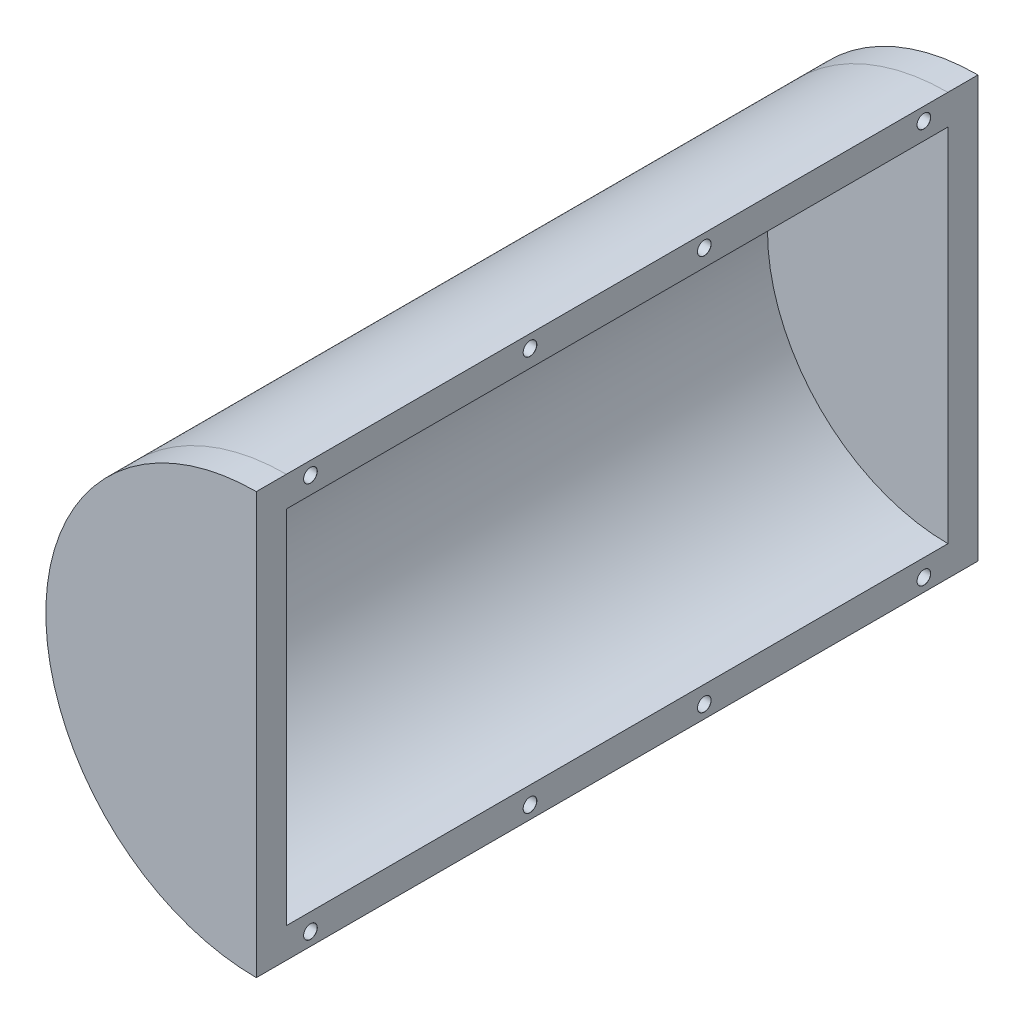
ISO-10303-21;
HEADER;
FILE_DESCRIPTION(('STEP AP214'),'2;1');
FILE_NAME('part.step','',(''),(''),'','','');
FILE_SCHEMA(('AUTOMOTIVE_DESIGN { 1 0 10303 214 1 1 1 1 }'));
ENDSEC;
DATA;
#1=APPLICATION_CONTEXT('core data for automotive mechanical design processes');
#2=APPLICATION_PROTOCOL_DEFINITION('international standard','automotive_design',2000,#1);
#3=PRODUCT_CONTEXT('',#1,'mechanical');
#4=PRODUCT('Part','Part','',(#3));
#5=PRODUCT_RELATED_PRODUCT_CATEGORY('part','',(#4));
#6=PRODUCT_DEFINITION_FORMATION('','',#4);
#7=PRODUCT_DEFINITION_CONTEXT('part definition',#1,'design');
#8=PRODUCT_DEFINITION('design','',#6,#7);
#9=PRODUCT_DEFINITION_SHAPE('','',#8);
#10=(LENGTH_UNIT() NAMED_UNIT(*) SI_UNIT(.MILLI.,.METRE.));
#11=(NAMED_UNIT(*) PLANE_ANGLE_UNIT() SI_UNIT($,.RADIAN.));
#12=(NAMED_UNIT(*) SI_UNIT($,.STERADIAN.) SOLID_ANGLE_UNIT());
#13=UNCERTAINTY_MEASURE_WITH_UNIT(LENGTH_MEASURE(1.E-05),#10,'distance_accuracy_value','');
#14=(GEOMETRIC_REPRESENTATION_CONTEXT(3) GLOBAL_UNCERTAINTY_ASSIGNED_CONTEXT((#13)) GLOBAL_UNIT_ASSIGNED_CONTEXT((#10,
#11,#12)) REPRESENTATION_CONTEXT('',''));
#15=CARTESIAN_POINT('',(0.,0.,0.));
#16=DIRECTION('',(0.,0.,1.));
#17=DIRECTION('',(1.,0.,0.));
#18=AXIS2_PLACEMENT_3D('',#15,#16,#17);
#19=CARTESIAN_POINT('',(0.,70.0043098323688,-110.));
#20=DIRECTION('',(-1.,0.,0.));
#21=DIRECTION('',(0.,0.,1.));
#22=AXIS2_PLACEMENT_3D('',#19,#20,#21);
#23=PLANE('',#22);
#24=DIRECTION('',(0.,0.,1.));
#25=VECTOR('',#24,1.);
#26=CARTESIAN_POINT('',(0.,-60.,-110.));
#27=LINE('',#26,#25);
#28=CARTESIAN_POINT('',(0.,-60.,-110.));
#29=VERTEX_POINT('',#28);
#30=CARTESIAN_POINT('',(0.,-60.,110.));
#31=VERTEX_POINT('',#30);
#32=EDGE_CURVE('E273',#29,#31,#27,.T.);
#33=ORIENTED_EDGE('',*,*,#32,.T.);
#34=DIRECTION('',(0.,1.,0.));
#35=VECTOR('',#34,1.);
#36=CARTESIAN_POINT('',(0.,70.0043098323688,110.));
#37=LINE('',#36,#35);
#38=CARTESIAN_POINT('',(0.,60.,110.));
#39=VERTEX_POINT('',#38);
#40=EDGE_CURVE('E158',#31,#39,#37,.T.);
#41=ORIENTED_EDGE('',*,*,#40,.T.);
#42=DIRECTION('',(0.,0.,1.));
#43=VECTOR('',#42,1.);
#44=CARTESIAN_POINT('',(0.,60.,-110.));
#45=LINE('',#44,#43);
#46=CARTESIAN_POINT('',(0.,60.,-110.));
#47=VERTEX_POINT('',#46);
#48=EDGE_CURVE('E101',#47,#39,#45,.T.);
#49=ORIENTED_EDGE('',*,*,#48,.F.);
#50=DIRECTION('',(0.,1.,0.));
#51=VECTOR('',#50,1.);
#52=CARTESIAN_POINT('',(0.,-60.,-110.));
#53=LINE('',#52,#51);
#54=EDGE_CURVE('E94',#29,#47,#53,.T.);
#55=ORIENTED_EDGE('',*,*,#54,.F.);
#56=EDGE_LOOP('',(#33,#41,#49,#55));
#57=FACE_BOUND('',#56,.T.);
#58=CARTESIAN_POINT('',(0.,-65.7095087836172,102.000000000089));
#59=DIRECTION('',(1.,0.,0.));
#60=DIRECTION('',(0.,0.,-1.));
#61=AXIS2_PLACEMENT_3D('',#58,#59,#60);
#62=CIRCLE('',#61,2.275);
#63=CARTESIAN_POINT('',(0.,-65.7095087836172,99.7250000000891));
#64=VERTEX_POINT('',#63);
#65=EDGE_CURVE('E194',#64,#64,#62,.T.);
#66=ORIENTED_EDGE('',*,*,#65,.F.);
#67=EDGE_LOOP('',(#66));
#68=FACE_BOUND('',#67,.T.);
#69=CARTESIAN_POINT('',(0.,65.7095087836172,102.000000000089));
#70=DIRECTION('',(1.,0.,0.));
#71=DIRECTION('',(0.,0.,-1.));
#72=AXIS2_PLACEMENT_3D('',#69,#70,#71);
#73=CIRCLE('',#72,2.275);
#74=CARTESIAN_POINT('',(0.,65.7095087836172,99.7250000000891));
#75=VERTEX_POINT('',#74);
#76=EDGE_CURVE('E206',#75,#75,#73,.T.);
#77=ORIENTED_EDGE('',*,*,#76,.F.);
#78=EDGE_LOOP('',(#77));
#79=FACE_BOUND('',#78,.T.);
#80=CARTESIAN_POINT('',(0.,65.7095087836171,-28.9841035327451));
#81=DIRECTION('',(1.,0.,0.));
#82=DIRECTION('',(0.,0.,-1.));
#83=AXIS2_PLACEMENT_3D('',#80,#81,#82);
#84=CIRCLE('',#83,2.275);
#85=CARTESIAN_POINT('',(0.,65.7095087836171,-31.2591035327451));
#86=VERTEX_POINT('',#85);
#87=EDGE_CURVE('E220',#86,#86,#84,.T.);
#88=ORIENTED_EDGE('',*,*,#87,.F.);
#89=EDGE_LOOP('',(#88));
#90=FACE_BOUND('',#89,.T.);
#91=CARTESIAN_POINT('',(0.,-65.7095087836171,-28.9841035327451));
#92=DIRECTION('',(1.,0.,0.));
#93=DIRECTION('',(0.,0.,-1.));
#94=AXIS2_PLACEMENT_3D('',#91,#92,#93);
#95=CIRCLE('',#94,2.275);
#96=CARTESIAN_POINT('',(0.,-65.7095087836171,-31.2591035327451));
#97=VERTEX_POINT('',#96);
#98=EDGE_CURVE('E232',#97,#97,#95,.T.);
#99=ORIENTED_EDGE('',*,*,#98,.F.);
#100=EDGE_LOOP('',(#99));
#101=FACE_BOUND('',#100,.T.);
#102=CARTESIAN_POINT('',(0.,-65.7095087836172,-102.000000000089));
#103=DIRECTION('',(1.,0.,0.));
#104=DIRECTION('',(0.,0.,-1.));
#105=AXIS2_PLACEMENT_3D('',#102,#103,#104);
#106=CIRCLE('',#105,2.275);
#107=CARTESIAN_POINT('',(0.,-65.7095087836172,-104.275000000089));
#108=VERTEX_POINT('',#107);
#109=EDGE_CURVE('E244',#108,#108,#106,.T.);
#110=ORIENTED_EDGE('',*,*,#109,.F.);
#111=EDGE_LOOP('',(#110));
#112=FACE_BOUND('',#111,.T.);
#113=CARTESIAN_POINT('',(0.,65.7095087836172,-102.000000000089));
#114=DIRECTION('',(1.,0.,0.));
#115=DIRECTION('',(0.,0.,-1.));
#116=AXIS2_PLACEMENT_3D('',#113,#114,#115);
#117=CIRCLE('',#116,2.275);
#118=CARTESIAN_POINT('',(0.,65.7095087836172,-104.275000000089));
#119=VERTEX_POINT('',#118);
#120=EDGE_CURVE('E256',#119,#119,#117,.T.);
#121=ORIENTED_EDGE('',*,*,#120,.F.);
#122=EDGE_LOOP('',(#121));
#123=FACE_BOUND('',#122,.T.);
#124=DIRECTION('',(0.,1.,0.));
#125=VECTOR('',#124,1.);
#126=CARTESIAN_POINT('',(0.,70.0043098323688,-120.));
#127=LINE('',#126,#125);
#128=CARTESIAN_POINT('',(0.,-70.0043098323688,-120.));
#129=VERTEX_POINT('',#128);
#130=CARTESIAN_POINT('',(0.,70.0043098323688,-120.));
#131=VERTEX_POINT('',#130);
#132=EDGE_CURVE('E79',#129,#131,#127,.T.);
#133=ORIENTED_EDGE('',*,*,#132,.T.);
#134=DIRECTION('',(0.,0.,-1.));
#135=VECTOR('',#134,1.);
#136=CARTESIAN_POINT('',(0.,70.0043098323688,-110.));
#137=LINE('',#136,#135);
#138=CARTESIAN_POINT('',(0.,70.0021549161844,-110.));
#139=VERTEX_POINT('',#138);
#140=EDGE_CURVE('E54',#139,#131,#137,.T.);
#141=ORIENTED_EDGE('',*,*,#140,.F.);
#142=DIRECTION('',(0.,0.,1.));
#143=VECTOR('',#142,1.);
#144=CARTESIAN_POINT('',(0.,70.,-110.));
#145=LINE('',#144,#143);
#146=CARTESIAN_POINT('',(0.,70.0021549161844,110.));
#147=VERTEX_POINT('',#146);
#148=EDGE_CURVE('E98',#139,#147,#145,.T.);
#149=ORIENTED_EDGE('',*,*,#148,.T.);
#150=DIRECTION('',(0.,0.,1.));
#151=VECTOR('',#150,1.);
#152=CARTESIAN_POINT('',(0.,70.0043098323688,110.));
#153=LINE('',#152,#151);
#154=CARTESIAN_POINT('',(0.,70.0043098323688,120.));
#155=VERTEX_POINT('',#154);
#156=EDGE_CURVE('E143',#147,#155,#153,.T.);
#157=ORIENTED_EDGE('',*,*,#156,.T.);
#158=DIRECTION('',(0.,1.,0.));
#159=VECTOR('',#158,1.);
#160=CARTESIAN_POINT('',(0.,-60.,120.));
#161=LINE('',#160,#159);
#162=CARTESIAN_POINT('',(0.,-70.0043098323688,120.));
#163=VERTEX_POINT('',#162);
#164=EDGE_CURVE('E172',#163,#155,#161,.T.);
#165=ORIENTED_EDGE('',*,*,#164,.F.);
#166=DIRECTION('',(0.,0.,1.));
#167=VECTOR('',#166,1.);
#168=CARTESIAN_POINT('',(0.,-70.0043098323688,110.));
#169=LINE('',#168,#167);
#170=CARTESIAN_POINT('',(0.,-70.0021549161844,110.));
#171=VERTEX_POINT('',#170);
#172=EDGE_CURVE('E151',#171,#163,#169,.T.);
#173=ORIENTED_EDGE('',*,*,#172,.F.);
#174=DIRECTION('',(0.,0.,1.));
#175=VECTOR('',#174,1.);
#176=CARTESIAN_POINT('',(0.,-70.,-110.));
#177=LINE('',#176,#175);
#178=CARTESIAN_POINT('',(0.,-70.0021549161844,-110.));
#179=VERTEX_POINT('',#178);
#180=EDGE_CURVE('E130',#179,#171,#177,.T.);
#181=ORIENTED_EDGE('',*,*,#180,.F.);
#182=DIRECTION('',(0.,0.,-1.));
#183=VECTOR('',#182,1.);
#184=CARTESIAN_POINT('',(0.,-70.0043098323688,-110.));
#185=LINE('',#184,#183);
#186=EDGE_CURVE('E11',#179,#129,#185,.T.);
#187=ORIENTED_EDGE('',*,*,#186,.T.);
#188=EDGE_LOOP('',(#133,#141,#149,#157,#165,#173,#181,#187));
#189=FACE_BOUND('',#188,.T.);
#190=CARTESIAN_POINT('',(0.,-65.7095087836171,28.9841035327451));
#191=DIRECTION('',(1.,0.,0.));
#192=DIRECTION('',(0.,0.,-1.));
#193=AXIS2_PLACEMENT_3D('',#190,#191,#192);
#194=CIRCLE('',#193,2.275);
#195=CARTESIAN_POINT('',(0.,-65.7095087836171,26.7091035327451));
#196=VERTEX_POINT('',#195);
#197=EDGE_CURVE('E182',#196,#196,#194,.T.);
#198=ORIENTED_EDGE('',*,*,#197,.F.);
#199=EDGE_LOOP('',(#198));
#200=FACE_BOUND('',#199,.T.);
#201=CARTESIAN_POINT('',(0.,65.7095087836171,28.9841035327451));
#202=DIRECTION('',(1.,0.,0.));
#203=DIRECTION('',(0.,0.,-1.));
#204=AXIS2_PLACEMENT_3D('',#201,#202,#203);
#205=CIRCLE('',#204,2.275);
#206=CARTESIAN_POINT('',(0.,65.7095087836171,26.7091035327451));
#207=VERTEX_POINT('',#206);
#208=EDGE_CURVE('E150',#207,#207,#205,.T.);
#209=ORIENTED_EDGE('',*,*,#208,.F.);
#210=EDGE_LOOP('',(#209));
#211=FACE_BOUND('',#210,.T.);
#212=ADVANCED_FACE('F41',(#57,#68,#79,#90,#101,#112,#123,#189,#200,#211),#23,.F.);
#213=CARTESIAN_POINT('',(0.,0.,-110.));
#214=DIRECTION('',(0.,0.,1.));
#215=DIRECTION('',(1.,0.,0.));
#216=AXIS2_PLACEMENT_3D('',#213,#214,#215);
#217=PLANE('',#216);
#218=CARTESIAN_POINT('',(0.,0.,-110.));
#219=DIRECTION('',(0.,0.,-1.));
#220=DIRECTION('',(1.,0.,0.));
#221=AXIS2_PLACEMENT_3D('',#218,#219,#220);
#222=CIRCLE('',#221,60.);
#223=EDGE_CURVE('E61',#29,#47,#222,.T.);
#224=ORIENTED_EDGE('',*,*,#223,.F.);
#225=ORIENTED_EDGE('',*,*,#54,.T.);
#226=EDGE_LOOP('',(#224,#225));
#227=FACE_BOUND('',#226,.T.);
#228=ADVANCED_FACE('F292',(#227),#217,.T.);
#229=CARTESIAN_POINT('',(0.,0.,-110.));
#230=DIRECTION('',(0.,0.,-1.));
#231=DIRECTION('',(-1.,0.,0.));
#232=AXIS2_PLACEMENT_3D('',#229,#230,#231);
#233=CYLINDRICAL_SURFACE('',#232,70.0043098323688);
#234=CARTESIAN_POINT('',(0.,0.,-120.));
#235=DIRECTION('',(0.,0.,1.));
#236=DIRECTION('',(1.,0.,0.));
#237=AXIS2_PLACEMENT_3D('',#234,#235,#236);
#238=CIRCLE('',#237,70.0043098323688);
#239=EDGE_CURVE('E87',#131,#129,#238,.T.);
#240=ORIENTED_EDGE('',*,*,#239,.T.);
#241=ORIENTED_EDGE('',*,*,#186,.F.);
#242=CARTESIAN_POINT('',(0.,0.,-110.));
#243=DIRECTION('',(0.,0.,1.));
#244=DIRECTION('',(0.,1.,0.));
#245=AXIS2_PLACEMENT_3D('',#242,#243,#244);
#246=CIRCLE('',#245,70.);
#247=EDGE_CURVE('E86',#139,#179,#246,.T.);
#248=ORIENTED_EDGE('',*,*,#247,.F.);
#249=ORIENTED_EDGE('',*,*,#140,.T.);
#250=EDGE_LOOP('',(#240,#241,#248,#249));
#251=FACE_BOUND('',#250,.T.);
#252=ADVANCED_FACE('F43',(#251),#233,.T.);
#253=CARTESIAN_POINT('',(0.,0.,-120.));
#254=DIRECTION('',(0.,0.,1.));
#255=DIRECTION('',(1.,0.,0.));
#256=AXIS2_PLACEMENT_3D('',#253,#254,#255);
#257=PLANE('',#256);
#258=ORIENTED_EDGE('',*,*,#239,.F.);
#259=ORIENTED_EDGE('',*,*,#132,.F.);
#260=EDGE_LOOP('',(#258,#259));
#261=FACE_BOUND('',#260,.T.);
#262=ADVANCED_FACE('F96',(#261),#257,.F.);
#263=CARTESIAN_POINT('',(0.,0.,-110.));
#264=DIRECTION('',(0.,0.,1.));
#265=DIRECTION('',(1.,0.,0.));
#266=AXIS2_PLACEMENT_3D('',#263,#264,#265);
#267=CYLINDRICAL_SURFACE('',#266,70.);
#268=ORIENTED_EDGE('',*,*,#180,.T.);
#269=CARTESIAN_POINT('',(0.,0.,110.));
#270=DIRECTION('',(0.,0.,1.));
#271=DIRECTION('',(0.,1.,0.));
#272=AXIS2_PLACEMENT_3D('',#269,#270,#271);
#273=CIRCLE('',#272,70.0043098323688);
#274=EDGE_CURVE('E126',#147,#171,#273,.T.);
#275=ORIENTED_EDGE('',*,*,#274,.F.);
#276=ORIENTED_EDGE('',*,*,#148,.F.);
#277=ORIENTED_EDGE('',*,*,#247,.T.);
#278=EDGE_LOOP('',(#268,#275,#276,#277));
#279=FACE_BOUND('',#278,.T.);
#280=ADVANCED_FACE('F128',(#279),#267,.T.);
#281=CARTESIAN_POINT('',(0.,0.,-110.));
#282=DIRECTION('',(0.,0.,1.));
#283=DIRECTION('',(1.,0.,0.));
#284=AXIS2_PLACEMENT_3D('',#281,#282,#283);
#285=CYLINDRICAL_SURFACE('',#284,60.);
#286=ORIENTED_EDGE('',*,*,#48,.T.);
#287=CARTESIAN_POINT('',(0.,0.,110.));
#288=DIRECTION('',(0.,0.,-1.));
#289=DIRECTION('',(1.,0.,0.));
#290=AXIS2_PLACEMENT_3D('',#287,#288,#289);
#291=CIRCLE('',#290,60.);
#292=EDGE_CURVE('E139',#31,#39,#291,.T.);
#293=ORIENTED_EDGE('',*,*,#292,.F.);
#294=ORIENTED_EDGE('',*,*,#32,.F.);
#295=ORIENTED_EDGE('',*,*,#223,.T.);
#296=EDGE_LOOP('',(#286,#293,#294,#295));
#297=FACE_BOUND('',#296,.T.);
#298=ADVANCED_FACE('F290',(#297),#285,.F.);
#299=CARTESIAN_POINT('',(-10.05,65.7095087836172,-102.000000000089));
#300=DIRECTION('',(1.,0.,0.));
#301=DIRECTION('',(0.,0.,-1.));
#302=AXIS2_PLACEMENT_3D('',#299,#300,#301);
#303=CONICAL_SURFACE('',#302,2.25,1.02974425867666);
#304=CARTESIAN_POINT('',(-11.401936392812,65.7095087836172,-102.000000000089));
#305=VERTEX_POINT('',#304);
#306=VERTEX_LOOP('',#305);
#307=FACE_BOUND('',#306,.T.);
#308=CARTESIAN_POINT('',(-10.05,65.7095087836172,-102.000000000089));
#309=DIRECTION('',(1.,0.,0.));
#310=DIRECTION('',(0.,0.,-1.));
#311=AXIS2_PLACEMENT_3D('',#308,#309,#310);
#312=CIRCLE('',#311,2.25);
#313=CARTESIAN_POINT('',(-10.05,65.7095087836172,-104.250000000089));
#314=VERTEX_POINT('',#313);
#315=EDGE_CURVE('E264',#314,#314,#312,.T.);
#316=ORIENTED_EDGE('',*,*,#315,.T.);
#317=EDGE_LOOP('',(#316));
#318=FACE_BOUND('',#317,.T.);
#319=ADVANCED_FACE('F329',(#307,#318),#303,.F.);
#320=CARTESIAN_POINT('',(0.,65.7095087836172,-102.000000000089));
#321=DIRECTION('',(1.,0.,0.));
#322=DIRECTION('',(0.,0.,-1.));
#323=AXIS2_PLACEMENT_3D('',#320,#321,#322);
#324=CYLINDRICAL_SURFACE('',#323,2.25);
#325=ORIENTED_EDGE('',*,*,#315,.F.);
#326=EDGE_LOOP('',(#325));
#327=FACE_BOUND('',#326,.T.);
#328=CARTESIAN_POINT('',(-0.0249999999999972,65.7095087836172,-102.000000000089));
#329=DIRECTION('',(1.,0.,0.));
#330=DIRECTION('',(0.,0.,-1.));
#331=AXIS2_PLACEMENT_3D('',#328,#329,#330);
#332=CIRCLE('',#331,2.24999999999999);
#333=CARTESIAN_POINT('',(-0.0249999999999972,65.7095087836172,-104.250000000089));
#334=VERTEX_POINT('',#333);
#335=EDGE_CURVE('E260',#334,#334,#332,.T.);
#336=ORIENTED_EDGE('',*,*,#335,.T.);
#337=EDGE_LOOP('',(#336));
#338=FACE_BOUND('',#337,.T.);
#339=ADVANCED_FACE('F319',(#327,#338),#324,.F.);
#340=CARTESIAN_POINT('',(0.,65.7095087836172,-102.000000000089));
#341=DIRECTION('',(1.,0.,0.));
#342=DIRECTION('',(0.,0.,-1.));
#343=AXIS2_PLACEMENT_3D('',#340,#341,#342);
#344=CONICAL_SURFACE('',#343,2.275,0.785398163397691);
#345=ORIENTED_EDGE('',*,*,#335,.F.);
#346=EDGE_LOOP('',(#345));
#347=FACE_BOUND('',#346,.T.);
#348=ORIENTED_EDGE('',*,*,#120,.T.);
#349=EDGE_LOOP('',(#348));
#350=FACE_BOUND('',#349,.T.);
#351=ADVANCED_FACE('F316',(#347,#350),#344,.F.);
#352=CARTESIAN_POINT('',(-10.05,-65.7095087836172,-102.000000000089));
#353=DIRECTION('',(1.,0.,0.));
#354=DIRECTION('',(0.,0.,-1.));
#355=AXIS2_PLACEMENT_3D('',#352,#353,#354);
#356=CONICAL_SURFACE('',#355,2.25,1.02974425867666);
#357=CARTESIAN_POINT('',(-11.401936392812,-65.7095087836172,-102.000000000089));
#358=VERTEX_POINT('',#357);
#359=VERTEX_LOOP('',#358);
#360=FACE_BOUND('',#359,.T.);
#361=CARTESIAN_POINT('',(-10.05,-65.7095087836172,-102.000000000089));
#362=DIRECTION('',(1.,0.,0.));
#363=DIRECTION('',(0.,0.,-1.));
#364=AXIS2_PLACEMENT_3D('',#361,#362,#363);
#365=CIRCLE('',#364,2.25);
#366=CARTESIAN_POINT('',(-10.05,-65.7095087836172,-104.250000000089));
#367=VERTEX_POINT('',#366);
#368=EDGE_CURVE('E252',#367,#367,#365,.T.);
#369=ORIENTED_EDGE('',*,*,#368,.T.);
#370=EDGE_LOOP('',(#369));
#371=FACE_BOUND('',#370,.T.);
#372=ADVANCED_FACE('F318',(#360,#371),#356,.F.);
#373=CARTESIAN_POINT('',(0.,-65.7095087836172,-102.000000000089));
#374=DIRECTION('',(1.,0.,0.));
#375=DIRECTION('',(0.,0.,-1.));
#376=AXIS2_PLACEMENT_3D('',#373,#374,#375);
#377=CYLINDRICAL_SURFACE('',#376,2.25);
#378=ORIENTED_EDGE('',*,*,#368,.F.);
#379=EDGE_LOOP('',(#378));
#380=FACE_BOUND('',#379,.T.);
#381=CARTESIAN_POINT('',(-0.0249999999999972,-65.7095087836172,-102.000000000089));
#382=DIRECTION('',(1.,0.,0.));
#383=DIRECTION('',(0.,0.,-1.));
#384=AXIS2_PLACEMENT_3D('',#381,#382,#383);
#385=CIRCLE('',#384,2.24999999999999);
#386=CARTESIAN_POINT('',(-0.0249999999999972,-65.7095087836172,-104.250000000089));
#387=VERTEX_POINT('',#386);
#388=EDGE_CURVE('E248',#387,#387,#385,.T.);
#389=ORIENTED_EDGE('',*,*,#388,.T.);
#390=EDGE_LOOP('',(#389));
#391=FACE_BOUND('',#390,.T.);
#392=ADVANCED_FACE('F326',(#380,#391),#377,.F.);
#393=CARTESIAN_POINT('',(0.,-65.7095087836172,-102.000000000089));
#394=DIRECTION('',(1.,0.,0.));
#395=DIRECTION('',(0.,0.,-1.));
#396=AXIS2_PLACEMENT_3D('',#393,#394,#395);
#397=CONICAL_SURFACE('',#396,2.275,0.785398163397691);
#398=ORIENTED_EDGE('',*,*,#388,.F.);
#399=EDGE_LOOP('',(#398));
#400=FACE_BOUND('',#399,.T.);
#401=ORIENTED_EDGE('',*,*,#109,.T.);
#402=EDGE_LOOP('',(#401));
#403=FACE_BOUND('',#402,.T.);
#404=ADVANCED_FACE('F462',(#400,#403),#397,.F.);
#405=CARTESIAN_POINT('',(-10.05,-65.7095087836171,-28.9841035327451));
#406=DIRECTION('',(1.,0.,0.));
#407=DIRECTION('',(0.,0.,-1.));
#408=AXIS2_PLACEMENT_3D('',#405,#406,#407);
#409=CONICAL_SURFACE('',#408,2.25,1.02974425867666);
#410=CARTESIAN_POINT('',(-11.401936392812,-65.7095087836171,-28.9841035327451));
#411=VERTEX_POINT('',#410);
#412=VERTEX_LOOP('',#411);
#413=FACE_BOUND('',#412,.T.);
#414=CARTESIAN_POINT('',(-10.05,-65.7095087836171,-28.9841035327451));
#415=DIRECTION('',(1.,0.,0.));
#416=DIRECTION('',(0.,0.,-1.));
#417=AXIS2_PLACEMENT_3D('',#414,#415,#416);
#418=CIRCLE('',#417,2.25);
#419=CARTESIAN_POINT('',(-10.05,-65.7095087836171,-31.2341035327451));
#420=VERTEX_POINT('',#419);
#421=EDGE_CURVE('E240',#420,#420,#418,.T.);
#422=ORIENTED_EDGE('',*,*,#421,.T.);
#423=EDGE_LOOP('',(#422));
#424=FACE_BOUND('',#423,.T.);
#425=ADVANCED_FACE('F458',(#413,#424),#409,.F.);
#426=CARTESIAN_POINT('',(0.,-65.7095087836171,-28.9841035327451));
#427=DIRECTION('',(1.,0.,0.));
#428=DIRECTION('',(0.,0.,-1.));
#429=AXIS2_PLACEMENT_3D('',#426,#427,#428);
#430=CYLINDRICAL_SURFACE('',#429,2.25);
#431=ORIENTED_EDGE('',*,*,#421,.F.);
#432=EDGE_LOOP('',(#431));
#433=FACE_BOUND('',#432,.T.);
#434=CARTESIAN_POINT('',(-0.0249999999999972,-65.7095087836171,-28.9841035327451));
#435=DIRECTION('',(1.,0.,0.));
#436=DIRECTION('',(0.,0.,-1.));
#437=AXIS2_PLACEMENT_3D('',#434,#435,#436);
#438=CIRCLE('',#437,2.24999999999999);
#439=CARTESIAN_POINT('',(-0.0249999999999972,-65.7095087836171,-31.2341035327451));
#440=VERTEX_POINT('',#439);
#441=EDGE_CURVE('E236',#440,#440,#438,.T.);
#442=ORIENTED_EDGE('',*,*,#441,.T.);
#443=EDGE_LOOP('',(#442));
#444=FACE_BOUND('',#443,.T.);
#445=ADVANCED_FACE('F454',(#433,#444),#430,.F.);
#446=CARTESIAN_POINT('',(0.,-65.7095087836171,-28.9841035327451));
#447=DIRECTION('',(1.,0.,0.));
#448=DIRECTION('',(0.,0.,-1.));
#449=AXIS2_PLACEMENT_3D('',#446,#447,#448);
#450=CONICAL_SURFACE('',#449,2.275,0.785398163397691);
#451=ORIENTED_EDGE('',*,*,#441,.F.);
#452=EDGE_LOOP('',(#451));
#453=FACE_BOUND('',#452,.T.);
#454=ORIENTED_EDGE('',*,*,#98,.T.);
#455=EDGE_LOOP('',(#454));
#456=FACE_BOUND('',#455,.T.);
#457=ADVANCED_FACE('F450',(#453,#456),#450,.F.);
#458=CARTESIAN_POINT('',(-10.05,65.7095087836171,-28.9841035327451));
#459=DIRECTION('',(1.,0.,0.));
#460=DIRECTION('',(0.,0.,-1.));
#461=AXIS2_PLACEMENT_3D('',#458,#459,#460);
#462=CONICAL_SURFACE('',#461,2.25,1.02974425867666);
#463=CARTESIAN_POINT('',(-11.401936392812,65.7095087836171,-28.9841035327451));
#464=VERTEX_POINT('',#463);
#465=VERTEX_LOOP('',#464);
#466=FACE_BOUND('',#465,.T.);
#467=CARTESIAN_POINT('',(-10.05,65.7095087836171,-28.9841035327451));
#468=DIRECTION('',(1.,0.,0.));
#469=DIRECTION('',(0.,0.,-1.));
#470=AXIS2_PLACEMENT_3D('',#467,#468,#469);
#471=CIRCLE('',#470,2.25);
#472=CARTESIAN_POINT('',(-10.05,65.7095087836171,-31.2341035327451));
#473=VERTEX_POINT('',#472);
#474=EDGE_CURVE('E228',#473,#473,#471,.T.);
#475=ORIENTED_EDGE('',*,*,#474,.T.);
#476=EDGE_LOOP('',(#475));
#477=FACE_BOUND('',#476,.T.);
#478=ADVANCED_FACE('F446',(#466,#477),#462,.F.);
#479=CARTESIAN_POINT('',(0.,65.7095087836171,-28.9841035327451));
#480=DIRECTION('',(1.,0.,0.));
#481=DIRECTION('',(0.,0.,-1.));
#482=AXIS2_PLACEMENT_3D('',#479,#480,#481);
#483=CYLINDRICAL_SURFACE('',#482,2.25);
#484=ORIENTED_EDGE('',*,*,#474,.F.);
#485=EDGE_LOOP('',(#484));
#486=FACE_BOUND('',#485,.T.);
#487=CARTESIAN_POINT('',(-0.0249999999999972,65.7095087836171,-28.9841035327451));
#488=DIRECTION('',(1.,0.,0.));
#489=DIRECTION('',(0.,0.,-1.));
#490=AXIS2_PLACEMENT_3D('',#487,#488,#489);
#491=CIRCLE('',#490,2.24999999999999);
#492=CARTESIAN_POINT('',(-0.0249999999999972,65.7095087836171,-31.2341035327451));
#493=VERTEX_POINT('',#492);
#494=EDGE_CURVE('E224',#493,#493,#491,.T.);
#495=ORIENTED_EDGE('',*,*,#494,.T.);
#496=EDGE_LOOP('',(#495));
#497=FACE_BOUND('',#496,.T.);
#498=ADVANCED_FACE('F442',(#486,#497),#483,.F.);
#499=CARTESIAN_POINT('',(0.,65.7095087836171,-28.9841035327451));
#500=DIRECTION('',(1.,0.,0.));
#501=DIRECTION('',(0.,0.,-1.));
#502=AXIS2_PLACEMENT_3D('',#499,#500,#501);
#503=CONICAL_SURFACE('',#502,2.275,0.785398163397691);
#504=ORIENTED_EDGE('',*,*,#494,.F.);
#505=EDGE_LOOP('',(#504));
#506=FACE_BOUND('',#505,.T.);
#507=ORIENTED_EDGE('',*,*,#87,.T.);
#508=EDGE_LOOP('',(#507));
#509=FACE_BOUND('',#508,.T.);
#510=ADVANCED_FACE('F438',(#506,#509),#503,.F.);
#511=CARTESIAN_POINT('',(-10.05,65.7095087836172,102.000000000089));
#512=DIRECTION('',(1.,0.,0.));
#513=DIRECTION('',(0.,0.,-1.));
#514=AXIS2_PLACEMENT_3D('',#511,#512,#513);
#515=CONICAL_SURFACE('',#514,2.25,1.02974425867666);
#516=CARTESIAN_POINT('',(-11.401936392812,65.7095087836172,102.000000000089));
#517=VERTEX_POINT('',#516);
#518=VERTEX_LOOP('',#517);
#519=FACE_BOUND('',#518,.T.);
#520=CARTESIAN_POINT('',(-10.05,65.7095087836172,102.000000000089));
#521=DIRECTION('',(1.,0.,0.));
#522=DIRECTION('',(0.,0.,-1.));
#523=AXIS2_PLACEMENT_3D('',#520,#521,#522);
#524=CIRCLE('',#523,2.25);
#525=CARTESIAN_POINT('',(-10.05,65.7095087836172,99.7500000000891));
#526=VERTEX_POINT('',#525);
#527=EDGE_CURVE('E140',#526,#526,#524,.T.);
#528=ORIENTED_EDGE('',*,*,#527,.T.);
#529=EDGE_LOOP('',(#528));
#530=FACE_BOUND('',#529,.T.);
#531=ADVANCED_FACE('F434',(#519,#530),#515,.F.);
#532=CARTESIAN_POINT('',(0.,65.7095087836172,102.000000000089));
#533=DIRECTION('',(1.,0.,0.));
#534=DIRECTION('',(0.,0.,-1.));
#535=AXIS2_PLACEMENT_3D('',#532,#533,#534);
#536=CYLINDRICAL_SURFACE('',#535,2.25);
#537=ORIENTED_EDGE('',*,*,#527,.F.);
#538=EDGE_LOOP('',(#537));
#539=FACE_BOUND('',#538,.T.);
#540=CARTESIAN_POINT('',(-0.0249999999999972,65.7095087836172,102.000000000089));
#541=DIRECTION('',(1.,0.,0.));
#542=DIRECTION('',(0.,0.,-1.));
#543=AXIS2_PLACEMENT_3D('',#540,#541,#542);
#544=CIRCLE('',#543,2.24999999999999);
#545=CARTESIAN_POINT('',(-0.0249999999999972,65.7095087836172,99.7500000000892));
#546=VERTEX_POINT('',#545);
#547=EDGE_CURVE('E210',#546,#546,#544,.T.);
#548=ORIENTED_EDGE('',*,*,#547,.T.);
#549=EDGE_LOOP('',(#548));
#550=FACE_BOUND('',#549,.T.);
#551=ADVANCED_FACE('F430',(#539,#550),#536,.F.);
#552=CARTESIAN_POINT('',(0.,65.7095087836172,102.000000000089));
#553=DIRECTION('',(1.,0.,0.));
#554=DIRECTION('',(0.,0.,-1.));
#555=AXIS2_PLACEMENT_3D('',#552,#553,#554);
#556=CONICAL_SURFACE('',#555,2.275,0.785398163397691);
#557=ORIENTED_EDGE('',*,*,#547,.F.);
#558=EDGE_LOOP('',(#557));
#559=FACE_BOUND('',#558,.T.);
#560=ORIENTED_EDGE('',*,*,#76,.T.);
#561=EDGE_LOOP('',(#560));
#562=FACE_BOUND('',#561,.T.);
#563=ADVANCED_FACE('F426',(#559,#562),#556,.F.);
#564=CARTESIAN_POINT('',(-10.05,-65.7095087836172,102.000000000089));
#565=DIRECTION('',(1.,0.,0.));
#566=DIRECTION('',(0.,0.,-1.));
#567=AXIS2_PLACEMENT_3D('',#564,#565,#566);
#568=CONICAL_SURFACE('',#567,2.25,1.02974425867666);
#569=CARTESIAN_POINT('',(-11.401936392812,-65.7095087836172,102.000000000089));
#570=VERTEX_POINT('',#569);
#571=VERTEX_LOOP('',#570);
#572=FACE_BOUND('',#571,.T.);
#573=CARTESIAN_POINT('',(-10.05,-65.7095087836172,102.000000000089));
#574=DIRECTION('',(1.,0.,0.));
#575=DIRECTION('',(0.,0.,-1.));
#576=AXIS2_PLACEMENT_3D('',#573,#574,#575);
#577=CIRCLE('',#576,2.25);
#578=CARTESIAN_POINT('',(-10.05,-65.7095087836172,99.7500000000891));
#579=VERTEX_POINT('',#578);
#580=EDGE_CURVE('E202',#579,#579,#577,.T.);
#581=ORIENTED_EDGE('',*,*,#580,.T.);
#582=EDGE_LOOP('',(#581));
#583=FACE_BOUND('',#582,.T.);
#584=ADVANCED_FACE('F422',(#572,#583),#568,.F.);
#585=CARTESIAN_POINT('',(0.,-65.7095087836172,102.000000000089));
#586=DIRECTION('',(1.,0.,0.));
#587=DIRECTION('',(0.,0.,-1.));
#588=AXIS2_PLACEMENT_3D('',#585,#586,#587);
#589=CYLINDRICAL_SURFACE('',#588,2.25);
#590=ORIENTED_EDGE('',*,*,#580,.F.);
#591=EDGE_LOOP('',(#590));
#592=FACE_BOUND('',#591,.T.);
#593=CARTESIAN_POINT('',(-0.0249999999999972,-65.7095087836172,102.000000000089));
#594=DIRECTION('',(1.,0.,0.));
#595=DIRECTION('',(0.,0.,-1.));
#596=AXIS2_PLACEMENT_3D('',#593,#594,#595);
#597=CIRCLE('',#596,2.24999999999999);
#598=CARTESIAN_POINT('',(-0.0249999999999972,-65.7095087836172,99.7500000000892));
#599=VERTEX_POINT('',#598);
#600=EDGE_CURVE('E198',#599,#599,#597,.T.);
#601=ORIENTED_EDGE('',*,*,#600,.T.);
#602=EDGE_LOOP('',(#601));
#603=FACE_BOUND('',#602,.T.);
#604=ADVANCED_FACE('F418',(#592,#603),#589,.F.);
#605=CARTESIAN_POINT('',(0.,-65.7095087836172,102.000000000089));
#606=DIRECTION('',(1.,0.,0.));
#607=DIRECTION('',(0.,0.,-1.));
#608=AXIS2_PLACEMENT_3D('',#605,#606,#607);
#609=CONICAL_SURFACE('',#608,2.275,0.785398163397691);
#610=ORIENTED_EDGE('',*,*,#600,.F.);
#611=EDGE_LOOP('',(#610));
#612=FACE_BOUND('',#611,.T.);
#613=ORIENTED_EDGE('',*,*,#65,.T.);
#614=EDGE_LOOP('',(#613));
#615=FACE_BOUND('',#614,.T.);
#616=ADVANCED_FACE('F414',(#612,#615),#609,.F.);
#617=CARTESIAN_POINT('',(-10.05,-65.7095087836171,28.9841035327451));
#618=DIRECTION('',(1.,0.,0.));
#619=DIRECTION('',(0.,0.,-1.));
#620=AXIS2_PLACEMENT_3D('',#617,#618,#619);
#621=CONICAL_SURFACE('',#620,2.25,1.02974425867666);
#622=CARTESIAN_POINT('',(-11.401936392812,-65.7095087836171,28.9841035327451));
#623=VERTEX_POINT('',#622);
#624=VERTEX_LOOP('',#623);
#625=FACE_BOUND('',#624,.T.);
#626=CARTESIAN_POINT('',(-10.05,-65.7095087836171,28.9841035327451));
#627=DIRECTION('',(1.,0.,0.));
#628=DIRECTION('',(0.,0.,-1.));
#629=AXIS2_PLACEMENT_3D('',#626,#627,#628);
#630=CIRCLE('',#629,2.25);
#631=CARTESIAN_POINT('',(-10.05,-65.7095087836171,26.7341035327451));
#632=VERTEX_POINT('',#631);
#633=EDGE_CURVE('E190',#632,#632,#630,.T.);
#634=ORIENTED_EDGE('',*,*,#633,.T.);
#635=EDGE_LOOP('',(#634));
#636=FACE_BOUND('',#635,.T.);
#637=ADVANCED_FACE('F410',(#625,#636),#621,.F.);
#638=CARTESIAN_POINT('',(0.,-65.7095087836171,28.9841035327451));
#639=DIRECTION('',(1.,0.,0.));
#640=DIRECTION('',(0.,0.,-1.));
#641=AXIS2_PLACEMENT_3D('',#638,#639,#640);
#642=CYLINDRICAL_SURFACE('',#641,2.25);
#643=ORIENTED_EDGE('',*,*,#633,.F.);
#644=EDGE_LOOP('',(#643));
#645=FACE_BOUND('',#644,.T.);
#646=CARTESIAN_POINT('',(-0.0249999999999972,-65.7095087836171,28.9841035327451));
#647=DIRECTION('',(1.,0.,0.));
#648=DIRECTION('',(0.,0.,-1.));
#649=AXIS2_PLACEMENT_3D('',#646,#647,#648);
#650=CIRCLE('',#649,2.24999999999999);
#651=CARTESIAN_POINT('',(-0.0249999999999972,-65.7095087836171,26.7341035327451));
#652=VERTEX_POINT('',#651);
#653=EDGE_CURVE('E186',#652,#652,#650,.T.);
#654=ORIENTED_EDGE('',*,*,#653,.T.);
#655=EDGE_LOOP('',(#654));
#656=FACE_BOUND('',#655,.T.);
#657=ADVANCED_FACE('F406',(#645,#656),#642,.F.);
#658=CARTESIAN_POINT('',(0.,-65.7095087836171,28.9841035327451));
#659=DIRECTION('',(1.,0.,0.));
#660=DIRECTION('',(0.,0.,-1.));
#661=AXIS2_PLACEMENT_3D('',#658,#659,#660);
#662=CONICAL_SURFACE('',#661,2.275,0.785398163397691);
#663=ORIENTED_EDGE('',*,*,#653,.F.);
#664=EDGE_LOOP('',(#663));
#665=FACE_BOUND('',#664,.T.);
#666=ORIENTED_EDGE('',*,*,#197,.T.);
#667=EDGE_LOOP('',(#666));
#668=FACE_BOUND('',#667,.T.);
#669=ADVANCED_FACE('F402',(#665,#668),#662,.F.);
#670=CARTESIAN_POINT('',(-10.05,65.7095087836171,28.9841035327451));
#671=DIRECTION('',(1.,0.,0.));
#672=DIRECTION('',(0.,0.,-1.));
#673=AXIS2_PLACEMENT_3D('',#670,#671,#672);
#674=CONICAL_SURFACE('',#673,2.25,1.02974425867666);
#675=CARTESIAN_POINT('',(-11.401936392812,65.7095087836171,28.9841035327451));
#676=VERTEX_POINT('',#675);
#677=VERTEX_LOOP('',#676);
#678=FACE_BOUND('',#677,.T.);
#679=CARTESIAN_POINT('',(-10.05,65.7095087836171,28.9841035327451));
#680=DIRECTION('',(1.,0.,0.));
#681=DIRECTION('',(0.,0.,-1.));
#682=AXIS2_PLACEMENT_3D('',#679,#680,#681);
#683=CIRCLE('',#682,2.25);
#684=CARTESIAN_POINT('',(-10.05,65.7095087836171,26.7341035327451));
#685=VERTEX_POINT('',#684);
#686=EDGE_CURVE('E178',#685,#685,#683,.T.);
#687=ORIENTED_EDGE('',*,*,#686,.T.);
#688=EDGE_LOOP('',(#687));
#689=FACE_BOUND('',#688,.T.);
#690=ADVANCED_FACE('F398',(#678,#689),#674,.F.);
#691=CARTESIAN_POINT('',(0.,65.7095087836171,28.9841035327451));
#692=DIRECTION('',(1.,0.,0.));
#693=DIRECTION('',(0.,0.,-1.));
#694=AXIS2_PLACEMENT_3D('',#691,#692,#693);
#695=CYLINDRICAL_SURFACE('',#694,2.25);
#696=ORIENTED_EDGE('',*,*,#686,.F.);
#697=EDGE_LOOP('',(#696));
#698=FACE_BOUND('',#697,.T.);
#699=CARTESIAN_POINT('',(-0.0249999999999972,65.7095087836171,28.9841035327451));
#700=DIRECTION('',(1.,0.,0.));
#701=DIRECTION('',(0.,0.,-1.));
#702=AXIS2_PLACEMENT_3D('',#699,#700,#701);
#703=CIRCLE('',#702,2.24999999999999);
#704=CARTESIAN_POINT('',(-0.0249999999999972,65.7095087836171,26.7341035327451));
#705=VERTEX_POINT('',#704);
#706=EDGE_CURVE('E156',#705,#705,#703,.T.);
#707=ORIENTED_EDGE('',*,*,#706,.T.);
#708=EDGE_LOOP('',(#707));
#709=FACE_BOUND('',#708,.T.);
#710=ADVANCED_FACE('F394',(#698,#709),#695,.F.);
#711=CARTESIAN_POINT('',(0.,65.7095087836171,28.9841035327451));
#712=DIRECTION('',(1.,0.,0.));
#713=DIRECTION('',(0.,0.,-1.));
#714=AXIS2_PLACEMENT_3D('',#711,#712,#713);
#715=CONICAL_SURFACE('',#714,2.275,0.785398163397691);
#716=ORIENTED_EDGE('',*,*,#706,.F.);
#717=EDGE_LOOP('',(#716));
#718=FACE_BOUND('',#717,.T.);
#719=ORIENTED_EDGE('',*,*,#208,.T.);
#720=EDGE_LOOP('',(#719));
#721=FACE_BOUND('',#720,.T.);
#722=ADVANCED_FACE('F391',(#718,#721),#715,.F.);
#723=CARTESIAN_POINT('',(0.,0.,110.));
#724=DIRECTION('',(0.,0.,-1.));
#725=DIRECTION('',(1.,0.,0.));
#726=AXIS2_PLACEMENT_3D('',#723,#724,#725);
#727=PLANE('',#726);
#728=ORIENTED_EDGE('',*,*,#40,.F.);
#729=ORIENTED_EDGE('',*,*,#292,.T.);
#730=EDGE_LOOP('',(#728,#729));
#731=FACE_BOUND('',#730,.T.);
#732=ADVANCED_FACE('F387',(#731),#727,.T.);
#733=CARTESIAN_POINT('',(0.,0.,110.));
#734=DIRECTION('',(0.,0.,1.));
#735=DIRECTION('',(1.,0.,0.));
#736=AXIS2_PLACEMENT_3D('',#733,#734,#735);
#737=CYLINDRICAL_SURFACE('',#736,70.0043098323688);
#738=CARTESIAN_POINT('',(0.,0.,120.));
#739=DIRECTION('',(0.,0.,1.));
#740=DIRECTION('',(1.,0.,0.));
#741=AXIS2_PLACEMENT_3D('',#738,#739,#740);
#742=CIRCLE('',#741,70.0043098323688);
#743=EDGE_CURVE('E147',#155,#163,#742,.T.);
#744=ORIENTED_EDGE('',*,*,#743,.F.);
#745=ORIENTED_EDGE('',*,*,#156,.F.);
#746=ORIENTED_EDGE('',*,*,#274,.T.);
#747=ORIENTED_EDGE('',*,*,#172,.T.);
#748=EDGE_LOOP('',(#744,#745,#746,#747));
#749=FACE_BOUND('',#748,.T.);
#750=ADVANCED_FACE('F144',(#749),#737,.T.);
#751=CARTESIAN_POINT('',(0.,0.,120.));
#752=DIRECTION('',(0.,0.,-1.));
#753=DIRECTION('',(1.,0.,0.));
#754=AXIS2_PLACEMENT_3D('',#751,#752,#753);
#755=PLANE('',#754);
#756=ORIENTED_EDGE('',*,*,#743,.T.);
#757=ORIENTED_EDGE('',*,*,#164,.T.);
#758=EDGE_LOOP('',(#756,#757));
#759=FACE_BOUND('',#758,.T.);
#760=ADVANCED_FACE('F375',(#759),#755,.F.);
#761=CLOSED_SHELL('',(#212,#228,#252,#262,#280,#298,#319,#339,#351,#372,#392,#404,#425,#445,
#457,#478,#498,#510,#531,#551,#563,#584,#604,#616,#637,#657,#669,#690,#710,#722,#732,#750,#760));
#762=MANIFOLD_SOLID_BREP('B2',#761);
#763=ADVANCED_BREP_SHAPE_REPRESENTATION('',(#18,#762),#14);
#764=SHAPE_DEFINITION_REPRESENTATION(#9,#763);
ENDSEC;
END-ISO-10303-21;
